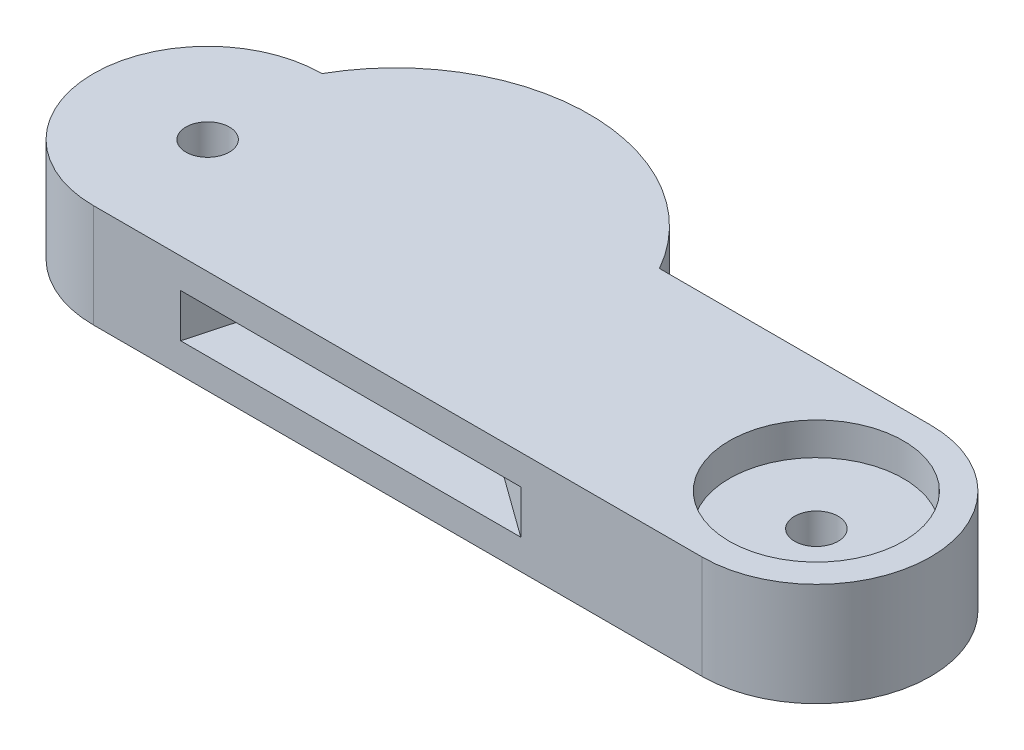
ISO-10303-21;
HEADER;
FILE_DESCRIPTION(('STEP AP214'),'2;1');
FILE_NAME('part.step','',(''),(''),'','','');
FILE_SCHEMA(('AUTOMOTIVE_DESIGN { 1 0 10303 214 1 1 1 1 }'));
ENDSEC;
DATA;
#1=APPLICATION_CONTEXT('core data for automotive mechanical design processes');
#2=APPLICATION_PROTOCOL_DEFINITION('international standard','automotive_design',2000,#1);
#3=PRODUCT_CONTEXT('',#1,'mechanical');
#4=PRODUCT('Part','Part','',(#3));
#5=PRODUCT_RELATED_PRODUCT_CATEGORY('part','',(#4));
#6=PRODUCT_DEFINITION_FORMATION('','',#4);
#7=PRODUCT_DEFINITION_CONTEXT('part definition',#1,'design');
#8=PRODUCT_DEFINITION('design','',#6,#7);
#9=PRODUCT_DEFINITION_SHAPE('','',#8);
#10=(LENGTH_UNIT() NAMED_UNIT(*) SI_UNIT(.MILLI.,.METRE.));
#11=(NAMED_UNIT(*) PLANE_ANGLE_UNIT() SI_UNIT($,.RADIAN.));
#12=(NAMED_UNIT(*) SI_UNIT($,.STERADIAN.) SOLID_ANGLE_UNIT());
#13=UNCERTAINTY_MEASURE_WITH_UNIT(LENGTH_MEASURE(1.E-05),#10,'distance_accuracy_value','');
#14=(GEOMETRIC_REPRESENTATION_CONTEXT(3) GLOBAL_UNCERTAINTY_ASSIGNED_CONTEXT((#13)) GLOBAL_UNIT_ASSIGNED_CONTEXT((#10,
#11,#12)) REPRESENTATION_CONTEXT('',''));
#15=CARTESIAN_POINT('',(0.,0.,0.));
#16=DIRECTION('',(0.,0.,1.));
#17=DIRECTION('',(1.,0.,0.));
#18=AXIS2_PLACEMENT_3D('',#15,#16,#17);
#19=CARTESIAN_POINT('',(0.,4.75,0.));
#20=DIRECTION('',(0.,-1.,0.));
#21=DIRECTION('',(0.,0.,-1.));
#22=AXIS2_PLACEMENT_3D('',#19,#20,#21);
#23=CYLINDRICAL_SURFACE('',#22,2.);
#24=CARTESIAN_POINT('',(0.,-4.75,0.));
#25=DIRECTION('',(0.,1.,0.));
#26=DIRECTION('',(0.,0.,1.));
#27=AXIS2_PLACEMENT_3D('',#24,#25,#26);
#28=CIRCLE('',#27,2.);
#29=CARTESIAN_POINT('',(0.,-4.75,2.));
#30=VERTEX_POINT('',#29);
#31=EDGE_CURVE('E202',#30,#30,#28,.T.);
#32=ORIENTED_EDGE('',*,*,#31,.F.);
#33=EDGE_LOOP('',(#32));
#34=FACE_BOUND('',#33,.T.);
#35=CARTESIAN_POINT('',(0.,1.75,0.));
#36=DIRECTION('',(0.,1.,0.));
#37=DIRECTION('',(0.,0.,1.));
#38=AXIS2_PLACEMENT_3D('',#35,#36,#37);
#39=CIRCLE('',#38,2.);
#40=CARTESIAN_POINT('',(0.,1.75,2.));
#41=VERTEX_POINT('',#40);
#42=EDGE_CURVE('E44',#41,#41,#39,.T.);
#43=ORIENTED_EDGE('',*,*,#42,.T.);
#44=EDGE_LOOP('',(#43));
#45=FACE_BOUND('',#44,.T.);
#46=ADVANCED_FACE('F40',(#34,#45),#23,.F.);
#47=CARTESIAN_POINT('',(-40.424119315667,37.0570550281998,-1.74605110135798));
#48=DIRECTION('',(0.,-1.,0.));
#49=DIRECTION('',(0.,0.,-1.));
#50=AXIS2_PLACEMENT_3D('',#47,#48,#49);
#51=CYLINDRICAL_SURFACE('',#50,17.8069548217707);
#52=CARTESIAN_POINT('',(-40.424119315667,4.75,-1.74605110135798));
#53=DIRECTION('',(0.,1.,0.));
#54=DIRECTION('',(0.,0.,1.));
#55=AXIS2_PLACEMENT_3D('',#52,#53,#54);
#56=CIRCLE('',#55,17.8069548217707);
#57=CARTESIAN_POINT('',(-24.9177003511623,4.75,-10.5003992165423));
#58=VERTEX_POINT('',#57);
#59=CARTESIAN_POINT('',(-55.9305382801716,4.75,-10.5003992165423));
#60=VERTEX_POINT('',#59);
#61=EDGE_CURVE('E166',#58,#60,#56,.T.);
#62=ORIENTED_EDGE('',*,*,#61,.F.);
#63=DIRECTION('',(0.,-1.,0.));
#64=VECTOR('',#63,1.);
#65=CARTESIAN_POINT('',(-24.9177003511623,37.0570550281998,-10.5003992165423));
#66=LINE('',#65,#64);
#67=CARTESIAN_POINT('',(-24.9177003511623,-4.75,-10.5003992165423));
#68=VERTEX_POINT('',#67);
#69=EDGE_CURVE('E165',#58,#68,#66,.T.);
#70=ORIENTED_EDGE('',*,*,#69,.T.);
#71=CARTESIAN_POINT('',(-40.424119315667,-4.75,-1.74605110135798));
#72=DIRECTION('',(0.,1.,0.));
#73=DIRECTION('',(0.,0.,1.));
#74=AXIS2_PLACEMENT_3D('',#71,#72,#73);
#75=CIRCLE('',#74,17.8069548217707);
#76=CARTESIAN_POINT('',(-55.9305382801715,-4.75,-10.5003992165423));
#77=VERTEX_POINT('',#76);
#78=EDGE_CURVE('E160',#77,#68,#75,.F.);
#79=ORIENTED_EDGE('',*,*,#78,.F.);
#80=DIRECTION('',(0.,-1.,0.));
#81=VECTOR('',#80,1.);
#82=CARTESIAN_POINT('',(-55.9305382801715,4.75,-10.5003992165423));
#83=LINE('',#82,#81);
#84=EDGE_CURVE('E245',#60,#77,#83,.T.);
#85=ORIENTED_EDGE('',*,*,#84,.F.);
#86=EDGE_LOOP('',(#62,#70,#79,#85));
#87=FACE_BOUND('',#86,.T.);
#88=CARTESIAN_POINT('',(-40.424119315667,-2.,-1.74605110135798));
#89=DIRECTION('',(0.,1.,0.));
#90=DIRECTION('',(0.,0.,1.));
#91=AXIS2_PLACEMENT_3D('',#88,#89,#90);
#92=CIRCLE('',#91,17.8069548217707);
#93=CARTESIAN_POINT('',(-35.7381547906298,-2.,-18.9253810211969));
#94=VERTEX_POINT('',#93);
#95=CARTESIAN_POINT('',(-54.8543825264001,-2.,-12.1794179449777));
#96=VERTEX_POINT('',#95);
#97=EDGE_CURVE('E128',#94,#96,#92,.T.);
#98=ORIENTED_EDGE('',*,*,#97,.F.);
#99=DIRECTION('',(0.,1.,0.));
#100=VECTOR('',#99,1.);
#101=CARTESIAN_POINT('',(-35.7381547906298,-2.,-18.9253810211969));
#102=LINE('',#101,#100);
#103=CARTESIAN_POINT('',(-35.7381547906298,2.,-18.9253810211969));
#104=VERTEX_POINT('',#103);
#105=EDGE_CURVE('E139',#94,#104,#102,.T.);
#106=ORIENTED_EDGE('',*,*,#105,.T.);
#107=CARTESIAN_POINT('',(-40.424119315667,2.,-1.74605110135798));
#108=DIRECTION('',(0.,1.,0.));
#109=DIRECTION('',(0.,0.,1.));
#110=AXIS2_PLACEMENT_3D('',#107,#108,#109);
#111=CIRCLE('',#110,17.8069548217707);
#112=CARTESIAN_POINT('',(-54.8543825264001,2.,-12.1794179449777));
#113=VERTEX_POINT('',#112);
#114=EDGE_CURVE('E149',#104,#113,#111,.T.);
#115=ORIENTED_EDGE('',*,*,#114,.T.);
#116=DIRECTION('',(0.,1.,0.));
#117=VECTOR('',#116,1.);
#118=CARTESIAN_POINT('',(-54.8543825264001,-2.,-12.1794179449777));
#119=LINE('',#118,#117);
#120=EDGE_CURVE('E145',#96,#113,#119,.T.);
#121=ORIENTED_EDGE('',*,*,#120,.F.);
#122=EDGE_LOOP('',(#98,#106,#115,#121));
#123=FACE_BOUND('',#122,.T.);
#124=ADVANCED_FACE('F147',(#87,#123),#51,.T.);
#125=CARTESIAN_POINT('',(0.,4.75,-10.5003992165423));
#126=DIRECTION('',(0.,0.,1.));
#127=DIRECTION('',(1.,0.,0.));
#128=AXIS2_PLACEMENT_3D('',#125,#126,#127);
#129=PLANE('',#128);
#130=ORIENTED_EDGE('',*,*,#69,.F.);
#131=DIRECTION('',(-1.,0.,0.));
#132=VECTOR('',#131,1.);
#133=CARTESIAN_POINT('',(0.,4.75,-10.5003992165423));
#134=LINE('',#133,#132);
#135=CARTESIAN_POINT('',(0.,4.75,-10.5003992165423));
#136=VERTEX_POINT('',#135);
#137=EDGE_CURVE('E214',#136,#58,#134,.T.);
#138=ORIENTED_EDGE('',*,*,#137,.F.);
#139=DIRECTION('',(0.,-1.,0.));
#140=VECTOR('',#139,1.);
#141=CARTESIAN_POINT('',(0.,4.75,-10.5003992165423));
#142=LINE('',#141,#140);
#143=CARTESIAN_POINT('',(0.,-4.75,-10.5003992165423));
#144=VERTEX_POINT('',#143);
#145=EDGE_CURVE('E248',#136,#144,#142,.T.);
#146=ORIENTED_EDGE('',*,*,#145,.T.);
#147=DIRECTION('',(-1.,0.,0.));
#148=VECTOR('',#147,1.);
#149=CARTESIAN_POINT('',(0.,-4.75,-10.5003992165423));
#150=LINE('',#149,#148);
#151=EDGE_CURVE('E229',#144,#68,#150,.T.);
#152=ORIENTED_EDGE('',*,*,#151,.T.);
#153=EDGE_LOOP('',(#130,#138,#146,#152));
#154=FACE_BOUND('',#153,.T.);
#155=ADVANCED_FACE('F289',(#154),#129,.F.);
#156=CARTESIAN_POINT('',(0.,4.75,10.5003992165423));
#157=DIRECTION('',(0.,0.,-1.));
#158=DIRECTION('',(-1.,0.,0.));
#159=AXIS2_PLACEMENT_3D('',#156,#157,#158);
#160=PLANE('',#159);
#161=DIRECTION('',(1.,0.,0.));
#162=VECTOR('',#161,1.);
#163=CARTESIAN_POINT('',(0.,-4.75,10.5003992165423));
#164=LINE('',#163,#162);
#165=CARTESIAN_POINT('',(-55.9305382801715,-4.75,10.5003992165423));
#166=VERTEX_POINT('',#165);
#167=CARTESIAN_POINT('',(0.,-4.75,10.5003992165423));
#168=VERTEX_POINT('',#167);
#169=EDGE_CURVE('E215',#166,#168,#164,.T.);
#170=ORIENTED_EDGE('',*,*,#169,.T.);
#171=DIRECTION('',(0.,-1.,0.));
#172=VECTOR('',#171,1.);
#173=CARTESIAN_POINT('',(0.,4.75,10.5003992165423));
#174=LINE('',#173,#172);
#175=CARTESIAN_POINT('',(0.,4.75,10.5003992165423));
#176=VERTEX_POINT('',#175);
#177=EDGE_CURVE('E225',#176,#168,#174,.T.);
#178=ORIENTED_EDGE('',*,*,#177,.F.);
#179=DIRECTION('',(1.,0.,0.));
#180=VECTOR('',#179,1.);
#181=CARTESIAN_POINT('',(0.,4.75,10.5003992165423));
#182=LINE('',#181,#180);
#183=CARTESIAN_POINT('',(-55.9305382801715,4.75,10.5003992165423));
#184=VERTEX_POINT('',#183);
#185=EDGE_CURVE('E222',#184,#176,#182,.T.);
#186=ORIENTED_EDGE('',*,*,#185,.F.);
#187=DIRECTION('',(0.,-1.,0.));
#188=VECTOR('',#187,1.);
#189=CARTESIAN_POINT('',(-55.9305382801715,4.75,10.5003992165423));
#190=LINE('',#189,#188);
#191=EDGE_CURVE('E241',#184,#166,#190,.T.);
#192=ORIENTED_EDGE('',*,*,#191,.T.);
#193=EDGE_LOOP('',(#170,#178,#186,#192));
#194=FACE_BOUND('',#193,.T.);
#195=DIRECTION('',(1.,0.,0.));
#196=VECTOR('',#195,1.);
#197=CARTESIAN_POINT('',(0.,-2.,10.5003992165423));
#198=LINE('',#197,#196);
#199=CARTESIAN_POINT('',(-47.9106890267398,-2.,10.5003992165423));
#200=VERTEX_POINT('',#199);
#201=CARTESIAN_POINT('',(-16.6592767209511,-2.,10.5003992165423));
#202=VERTEX_POINT('',#201);
#203=EDGE_CURVE('E11',#200,#202,#198,.T.);
#204=ORIENTED_EDGE('',*,*,#203,.F.);
#205=DIRECTION('',(0.,1.,0.));
#206=VECTOR('',#205,1.);
#207=CARTESIAN_POINT('',(-47.9106890267398,4.75,10.5003992165423));
#208=LINE('',#207,#206);
#209=CARTESIAN_POINT('',(-47.9106890267398,2.,10.5003992165423));
#210=VERTEX_POINT('',#209);
#211=EDGE_CURVE('E256',#200,#210,#208,.T.);
#212=ORIENTED_EDGE('',*,*,#211,.T.);
#213=DIRECTION('',(1.,0.,0.));
#214=VECTOR('',#213,1.);
#215=CARTESIAN_POINT('',(0.,2.,10.5003992165423));
#216=LINE('',#215,#214);
#217=CARTESIAN_POINT('',(-16.6592767209511,2.,10.5003992165423));
#218=VERTEX_POINT('',#217);
#219=EDGE_CURVE('E252',#210,#218,#216,.T.);
#220=ORIENTED_EDGE('',*,*,#219,.T.);
#221=DIRECTION('',(0.,-1.,0.));
#222=VECTOR('',#221,1.);
#223=CARTESIAN_POINT('',(-16.6592767209511,4.75,10.5003992165423));
#224=LINE('',#223,#222);
#225=EDGE_CURVE('E50',#218,#202,#224,.T.);
#226=ORIENTED_EDGE('',*,*,#225,.T.);
#227=EDGE_LOOP('',(#204,#212,#220,#226));
#228=FACE_BOUND('',#227,.T.);
#229=ADVANCED_FACE('F266',(#194,#228),#160,.F.);
#230=CARTESIAN_POINT('',(0.,4.75,0.));
#231=DIRECTION('',(0.,1.,0.));
#232=DIRECTION('',(0.,0.,1.));
#233=AXIS2_PLACEMENT_3D('',#230,#231,#232);
#234=PLANE('',#233);
#235=CARTESIAN_POINT('',(0.,4.75,0.));
#236=DIRECTION('',(0.,1.,0.));
#237=DIRECTION('',(0.,0.,1.));
#238=AXIS2_PLACEMENT_3D('',#235,#236,#237);
#239=CIRCLE('',#238,8.);
#240=CARTESIAN_POINT('',(0.,4.75,8.));
#241=VERTEX_POINT('',#240);
#242=EDGE_CURVE('E156',#241,#241,#239,.T.);
#243=ORIENTED_EDGE('',*,*,#242,.F.);
#244=EDGE_LOOP('',(#243));
#245=FACE_BOUND('',#244,.T.);
#246=CARTESIAN_POINT('',(0.,4.75,0.));
#247=DIRECTION('',(0.,1.,0.));
#248=DIRECTION('',(0.,0.,1.));
#249=AXIS2_PLACEMENT_3D('',#246,#247,#248);
#250=CIRCLE('',#249,10.5003992165423);
#251=EDGE_CURVE('E210',#176,#136,#250,.T.);
#252=ORIENTED_EDGE('',*,*,#251,.T.);
#253=ORIENTED_EDGE('',*,*,#137,.T.);
#254=ORIENTED_EDGE('',*,*,#61,.T.);
#255=CARTESIAN_POINT('',(-55.9305382801715,4.75,0.));
#256=DIRECTION('',(0.,1.,0.));
#257=DIRECTION('',(0.,0.,1.));
#258=AXIS2_PLACEMENT_3D('',#255,#256,#257);
#259=CIRCLE('',#258,10.5003992165423);
#260=EDGE_CURVE('E219',#60,#184,#259,.T.);
#261=ORIENTED_EDGE('',*,*,#260,.T.);
#262=ORIENTED_EDGE('',*,*,#185,.T.);
#263=EDGE_LOOP('',(#252,#253,#254,#261,#262));
#264=FACE_BOUND('',#263,.T.);
#265=CARTESIAN_POINT('',(-55.9305382801715,4.75,0.));
#266=DIRECTION('',(0.,1.,0.));
#267=DIRECTION('',(0.,0.,1.));
#268=AXIS2_PLACEMENT_3D('',#265,#266,#267);
#269=CIRCLE('',#268,2.);
#270=CARTESIAN_POINT('',(-55.9305382801715,4.75,2.));
#271=VERTEX_POINT('',#270);
#272=EDGE_CURVE('E198',#271,#271,#269,.T.);
#273=ORIENTED_EDGE('',*,*,#272,.F.);
#274=EDGE_LOOP('',(#273));
#275=FACE_BOUND('',#274,.T.);
#276=ADVANCED_FACE('F298',(#245,#264,#275),#234,.T.);
#277=CARTESIAN_POINT('',(0.,-4.75,0.));
#278=DIRECTION('',(0.,1.,0.));
#279=DIRECTION('',(0.,0.,1.));
#280=AXIS2_PLACEMENT_3D('',#277,#278,#279);
#281=PLANE('',#280);
#282=CARTESIAN_POINT('',(0.,-4.75,0.));
#283=DIRECTION('',(0.,1.,0.));
#284=DIRECTION('',(0.,0.,1.));
#285=AXIS2_PLACEMENT_3D('',#282,#283,#284);
#286=CIRCLE('',#285,10.5003992165423);
#287=EDGE_CURVE('E209',#168,#144,#286,.T.);
#288=ORIENTED_EDGE('',*,*,#287,.F.);
#289=ORIENTED_EDGE('',*,*,#169,.F.);
#290=CARTESIAN_POINT('',(-55.9305382801715,-4.75,0.));
#291=DIRECTION('',(0.,1.,0.));
#292=DIRECTION('',(0.,0.,1.));
#293=AXIS2_PLACEMENT_3D('',#290,#291,#292);
#294=CIRCLE('',#293,10.5003992165423);
#295=EDGE_CURVE('E233',#77,#166,#294,.T.);
#296=ORIENTED_EDGE('',*,*,#295,.F.);
#297=ORIENTED_EDGE('',*,*,#78,.T.);
#298=ORIENTED_EDGE('',*,*,#151,.F.);
#299=EDGE_LOOP('',(#288,#289,#296,#297,#298));
#300=FACE_BOUND('',#299,.T.);
#301=ORIENTED_EDGE('',*,*,#31,.T.);
#302=EDGE_LOOP('',(#301));
#303=FACE_BOUND('',#302,.T.);
#304=CARTESIAN_POINT('',(-55.9305382801715,-4.75,0.));
#305=DIRECTION('',(0.,1.,0.));
#306=DIRECTION('',(0.,0.,1.));
#307=AXIS2_PLACEMENT_3D('',#304,#305,#306);
#308=CIRCLE('',#307,2.);
#309=CARTESIAN_POINT('',(-55.9305382801715,-4.75,2.));
#310=VERTEX_POINT('',#309);
#311=EDGE_CURVE('E195',#310,#310,#308,.T.);
#312=ORIENTED_EDGE('',*,*,#311,.T.);
#313=EDGE_LOOP('',(#312));
#314=FACE_BOUND('',#313,.T.);
#315=ADVANCED_FACE('F301',(#300,#303,#314),#281,.F.);
#316=CARTESIAN_POINT('',(0.,4.75,0.));
#317=DIRECTION('',(0.,-1.,0.));
#318=DIRECTION('',(0.,0.,-1.));
#319=AXIS2_PLACEMENT_3D('',#316,#317,#318);
#320=CYLINDRICAL_SURFACE('',#319,10.5003992165423);
#321=ORIENTED_EDGE('',*,*,#287,.T.);
#322=ORIENTED_EDGE('',*,*,#145,.F.);
#323=ORIENTED_EDGE('',*,*,#251,.F.);
#324=ORIENTED_EDGE('',*,*,#177,.T.);
#325=EDGE_LOOP('',(#321,#322,#323,#324));
#326=FACE_BOUND('',#325,.T.);
#327=ADVANCED_FACE('F42',(#326),#320,.T.);
#328=CARTESIAN_POINT('',(-55.9305382801715,4.75,0.));
#329=DIRECTION('',(0.,-1.,0.));
#330=DIRECTION('',(0.,0.,-1.));
#331=AXIS2_PLACEMENT_3D('',#328,#329,#330);
#332=CYLINDRICAL_SURFACE('',#331,10.5003992165423);
#333=ORIENTED_EDGE('',*,*,#295,.T.);
#334=ORIENTED_EDGE('',*,*,#191,.F.);
#335=ORIENTED_EDGE('',*,*,#260,.F.);
#336=ORIENTED_EDGE('',*,*,#84,.T.);
#337=EDGE_LOOP('',(#333,#334,#335,#336));
#338=FACE_BOUND('',#337,.T.);
#339=ADVANCED_FACE('F309',(#338),#332,.T.);
#340=CARTESIAN_POINT('',(-55.9305382801715,4.75,0.));
#341=DIRECTION('',(0.,-1.,0.));
#342=DIRECTION('',(0.,0.,-1.));
#343=AXIS2_PLACEMENT_3D('',#340,#341,#342);
#344=CYLINDRICAL_SURFACE('',#343,2.);
#345=ORIENTED_EDGE('',*,*,#272,.T.);
#346=EDGE_LOOP('',(#345));
#347=FACE_BOUND('',#346,.T.);
#348=ORIENTED_EDGE('',*,*,#311,.F.);
#349=EDGE_LOOP('',(#348));
#350=FACE_BOUND('',#349,.T.);
#351=ADVANCED_FACE('F296',(#347,#350),#344,.F.);
#352=CARTESIAN_POINT('',(-43.8872651072946,-2.,-4.24997427651625));
#353=DIRECTION('',(-0.585915275691268,0.,0.810372315489384));
#354=DIRECTION('',(0.810372315489384,0.,0.585915275691268));
#355=AXIS2_PLACEMENT_3D('',#352,#353,#354);
#356=PLANE('',#355);
#357=DIRECTION('',(0.810372315489384,0.,0.585915275691268));
#358=VECTOR('',#357,1.);
#359=CARTESIAN_POINT('',(-43.8872651072946,2.,-4.24997427651625));
#360=LINE('',#359,#358);
#361=CARTESIAN_POINT('',(-43.8872651072946,2.,-4.24997427651625));
#362=VERTEX_POINT('',#361);
#363=EDGE_CURVE('E57',#113,#362,#360,.T.);
#364=ORIENTED_EDGE('',*,*,#363,.T.);
#365=DIRECTION('',(0.,1.,0.));
#366=VECTOR('',#365,1.);
#367=CARTESIAN_POINT('',(-43.8872651072946,-2.,-4.24997427651625));
#368=LINE('',#367,#366);
#369=CARTESIAN_POINT('',(-43.8872651072946,-2.,-4.24997427651625));
#370=VERTEX_POINT('',#369);
#371=EDGE_CURVE('E191',#370,#362,#368,.T.);
#372=ORIENTED_EDGE('',*,*,#371,.F.);
#373=DIRECTION('',(0.810372315489384,0.,0.585915275691268));
#374=VECTOR('',#373,1.);
#375=CARTESIAN_POINT('',(-43.8872651072946,-2.,-4.24997427651625));
#376=LINE('',#375,#374);
#377=EDGE_CURVE('E136',#96,#370,#376,.T.);
#378=ORIENTED_EDGE('',*,*,#377,.F.);
#379=ORIENTED_EDGE('',*,*,#120,.T.);
#380=EDGE_LOOP('',(#364,#372,#378,#379));
#381=FACE_BOUND('',#380,.T.);
#382=ADVANCED_FACE('F334',(#381),#356,.F.);
#383=CARTESIAN_POINT('',(-35.7518279113761,-2.,-18.8752536565784));
#384=DIRECTION('',(0.964753945398661,0.,0.263153614525274));
#385=DIRECTION('',(0.263153614525274,0.,-0.964753945398661));
#386=AXIS2_PLACEMENT_3D('',#383,#384,#385);
#387=PLANE('',#386);
#388=DIRECTION('',(0.263153614525274,0.,-0.964753945398661));
#389=VECTOR('',#388,1.);
#390=CARTESIAN_POINT('',(-35.7518279113761,-2.,-18.8752536565784));
#391=LINE('',#390,#389);
#392=CARTESIAN_POINT('',(-39.2995259463285,-2.,-5.86895054165513));
#393=VERTEX_POINT('',#392);
#394=EDGE_CURVE('E124',#393,#94,#391,.T.);
#395=ORIENTED_EDGE('',*,*,#394,.F.);
#396=DIRECTION('',(0.,1.,0.));
#397=VECTOR('',#396,1.);
#398=CARTESIAN_POINT('',(-39.2995259463285,-2.,-5.86895054165513));
#399=LINE('',#398,#397);
#400=CARTESIAN_POINT('',(-39.2995259463285,2.,-5.86895054165513));
#401=VERTEX_POINT('',#400);
#402=EDGE_CURVE('E181',#393,#401,#399,.T.);
#403=ORIENTED_EDGE('',*,*,#402,.T.);
#404=DIRECTION('',(0.263153614525274,0.,-0.964753945398661));
#405=VECTOR('',#404,1.);
#406=CARTESIAN_POINT('',(-35.7518279113761,2.,-18.8752536565784));
#407=LINE('',#406,#405);
#408=EDGE_CURVE('E141',#401,#104,#407,.T.);
#409=ORIENTED_EDGE('',*,*,#408,.T.);
#410=ORIENTED_EDGE('',*,*,#105,.F.);
#411=EDGE_LOOP('',(#395,#403,#409,#410));
#412=FACE_BOUND('',#411,.T.);
#413=ADVANCED_FACE('F140',(#412),#387,.F.);
#414=CARTESIAN_POINT('',(26.6452391554762,-2.,41.8104240945407));
#415=DIRECTION('',(0.585915275691268,0.,-0.810372315489384));
#416=DIRECTION('',(-0.810372315489384,0.,-0.585915275691268));
#417=AXIS2_PLACEMENT_3D('',#414,#415,#416);
#418=PLANE('',#417);
#419=DIRECTION('',(-0.810372315489384,0.,-0.585915275691268));
#420=VECTOR('',#419,1.);
#421=CARTESIAN_POINT('',(26.6452391554762,2.,41.8104240945407));
#422=LINE('',#421,#420);
#423=EDGE_CURVE('E64',#218,#401,#422,.T.);
#424=ORIENTED_EDGE('',*,*,#423,.T.);
#425=ORIENTED_EDGE('',*,*,#402,.F.);
#426=DIRECTION('',(-0.810372315489384,0.,-0.585915275691268));
#427=VECTOR('',#426,1.);
#428=CARTESIAN_POINT('',(26.6452391554762,-2.,41.8104240945407));
#429=LINE('',#428,#427);
#430=EDGE_CURVE('E131',#202,#393,#429,.T.);
#431=ORIENTED_EDGE('',*,*,#430,.F.);
#432=ORIENTED_EDGE('',*,*,#225,.F.);
#433=EDGE_LOOP('',(#424,#425,#431,#432));
#434=FACE_BOUND('',#433,.T.);
#435=ADVANCED_FACE('F268',(#434),#418,.F.);
#436=CARTESIAN_POINT('',(-43.8872651072946,-2.,-4.24997427651625));
#437=DIRECTION('',(-0.964753945398661,0.,-0.263153614525275));
#438=DIRECTION('',(-0.263153614525275,0.,0.964753945398661));
#439=AXIS2_PLACEMENT_3D('',#436,#437,#438);
#440=PLANE('',#439);
#441=DIRECTION('',(-0.263153614525275,0.,0.964753945398661));
#442=VECTOR('',#441,1.);
#443=CARTESIAN_POINT('',(-43.8872651072946,-2.,-4.24997427651625));
#444=LINE('',#443,#442);
#445=EDGE_CURVE('E177',#370,#200,#444,.T.);
#446=ORIENTED_EDGE('',*,*,#445,.F.);
#447=ORIENTED_EDGE('',*,*,#371,.T.);
#448=DIRECTION('',(-0.263153614525275,0.,0.964753945398661));
#449=VECTOR('',#448,1.);
#450=CARTESIAN_POINT('',(-43.8872651072946,2.,-4.24997427651625));
#451=LINE('',#450,#449);
#452=EDGE_CURVE('E173',#362,#210,#451,.T.);
#453=ORIENTED_EDGE('',*,*,#452,.T.);
#454=ORIENTED_EDGE('',*,*,#211,.F.);
#455=EDGE_LOOP('',(#446,#447,#453,#454));
#456=FACE_BOUND('',#455,.T.);
#457=ADVANCED_FACE('F280',(#456),#440,.F.);
#458=CARTESIAN_POINT('',(-41.5933955268116,-2.,-5.0594624090857));
#459=DIRECTION('',(0.,1.,0.));
#460=DIRECTION('',(0.,0.,1.));
#461=AXIS2_PLACEMENT_3D('',#458,#459,#460);
#462=PLANE('',#461);
#463=ORIENTED_EDGE('',*,*,#394,.T.);
#464=ORIENTED_EDGE('',*,*,#97,.T.);
#465=ORIENTED_EDGE('',*,*,#377,.T.);
#466=ORIENTED_EDGE('',*,*,#445,.T.);
#467=ORIENTED_EDGE('',*,*,#203,.T.);
#468=ORIENTED_EDGE('',*,*,#430,.T.);
#469=EDGE_LOOP('',(#463,#464,#465,#466,#467,#468));
#470=FACE_BOUND('',#469,.T.);
#471=ADVANCED_FACE('F126',(#470),#462,.T.);
#472=CARTESIAN_POINT('',(-41.5933955268116,2.,-5.0594624090857));
#473=DIRECTION('',(0.,1.,0.));
#474=DIRECTION('',(0.,0.,1.));
#475=AXIS2_PLACEMENT_3D('',#472,#473,#474);
#476=PLANE('',#475);
#477=ORIENTED_EDGE('',*,*,#408,.F.);
#478=ORIENTED_EDGE('',*,*,#423,.F.);
#479=ORIENTED_EDGE('',*,*,#219,.F.);
#480=ORIENTED_EDGE('',*,*,#452,.F.);
#481=ORIENTED_EDGE('',*,*,#363,.F.);
#482=ORIENTED_EDGE('',*,*,#114,.F.);
#483=EDGE_LOOP('',(#477,#478,#479,#480,#481,#482));
#484=FACE_BOUND('',#483,.T.);
#485=ADVANCED_FACE('F269',(#484),#476,.F.);
#486=CARTESIAN_POINT('',(0.,1.75,0.));
#487=DIRECTION('',(0.,1.,0.));
#488=DIRECTION('',(0.,0.,1.));
#489=AXIS2_PLACEMENT_3D('',#486,#487,#488);
#490=CYLINDRICAL_SURFACE('',#489,8.);
#491=CARTESIAN_POINT('',(0.,1.75,0.));
#492=DIRECTION('',(0.,1.,0.));
#493=DIRECTION('',(0.,0.,1.));
#494=AXIS2_PLACEMENT_3D('',#491,#492,#493);
#495=CIRCLE('',#494,8.);
#496=CARTESIAN_POINT('',(0.,1.75,8.));
#497=VERTEX_POINT('',#496);
#498=EDGE_CURVE('E504',#497,#497,#495,.T.);
#499=ORIENTED_EDGE('',*,*,#498,.F.);
#500=EDGE_LOOP('',(#499));
#501=FACE_BOUND('',#500,.T.);
#502=ORIENTED_EDGE('',*,*,#242,.T.);
#503=EDGE_LOOP('',(#502));
#504=FACE_BOUND('',#503,.T.);
#505=ADVANCED_FACE('F271',(#501,#504),#490,.F.);
#506=CARTESIAN_POINT('',(0.,1.75,0.));
#507=DIRECTION('',(0.,1.,0.));
#508=DIRECTION('',(0.,0.,1.));
#509=AXIS2_PLACEMENT_3D('',#506,#507,#508);
#510=PLANE('',#509);
#511=ORIENTED_EDGE('',*,*,#42,.F.);
#512=EDGE_LOOP('',(#511));
#513=FACE_BOUND('',#512,.T.);
#514=ORIENTED_EDGE('',*,*,#498,.T.);
#515=EDGE_LOOP('',(#514));
#516=FACE_BOUND('',#515,.T.);
#517=ADVANCED_FACE('F277',(#513,#516),#510,.T.);
#518=CLOSED_SHELL('',(#46,#124,#155,#229,#276,#315,#327,#339,#351,#382,#413,#435,#457,#471,#485,
#505,#517));
#519=MANIFOLD_SOLID_BREP('B2',#518);
#520=ADVANCED_BREP_SHAPE_REPRESENTATION('',(#18,#519),#14);
#521=SHAPE_DEFINITION_REPRESENTATION(#9,#520);
ENDSEC;
END-ISO-10303-21;
